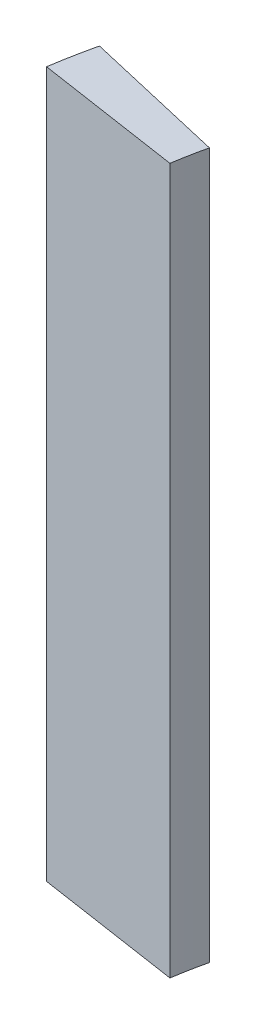
ISO-10303-21;
HEADER;
FILE_DESCRIPTION(('STEP AP214'),'2;1');
FILE_NAME('part.step','',(''),(''),'','','');
FILE_SCHEMA(('AUTOMOTIVE_DESIGN { 1 0 10303 214 1 1 1 1 }'));
ENDSEC;
DATA;
#1=APPLICATION_CONTEXT('core data for automotive mechanical design processes');
#2=APPLICATION_PROTOCOL_DEFINITION('international standard','automotive_design',2000,#1);
#3=PRODUCT_CONTEXT('',#1,'mechanical');
#4=PRODUCT('Part','Part','',(#3));
#5=PRODUCT_RELATED_PRODUCT_CATEGORY('part','',(#4));
#6=PRODUCT_DEFINITION_FORMATION('','',#4);
#7=PRODUCT_DEFINITION_CONTEXT('part definition',#1,'design');
#8=PRODUCT_DEFINITION('design','',#6,#7);
#9=PRODUCT_DEFINITION_SHAPE('','',#8);
#10=(LENGTH_UNIT() NAMED_UNIT(*) SI_UNIT(.MILLI.,.METRE.));
#11=(NAMED_UNIT(*) PLANE_ANGLE_UNIT() SI_UNIT($,.RADIAN.));
#12=(NAMED_UNIT(*) SI_UNIT($,.STERADIAN.) SOLID_ANGLE_UNIT());
#13=UNCERTAINTY_MEASURE_WITH_UNIT(LENGTH_MEASURE(1.E-05),#10,'distance_accuracy_value','');
#14=(GEOMETRIC_REPRESENTATION_CONTEXT(3) GLOBAL_UNCERTAINTY_ASSIGNED_CONTEXT((#13)) GLOBAL_UNIT_ASSIGNED_CONTEXT((#10,
#11,#12)) REPRESENTATION_CONTEXT('',''));
#15=CARTESIAN_POINT('',(0.,0.,0.));
#16=DIRECTION('',(0.,0.,1.));
#17=DIRECTION('',(1.,0.,0.));
#18=AXIS2_PLACEMENT_3D('',#15,#16,#17);
#19=CARTESIAN_POINT('',(33.9255423572014,48.,6.63702783067305));
#20=DIRECTION('',(0.,-1.,0.));
#21=DIRECTION('',(0.,0.,-1.));
#22=AXIS2_PLACEMENT_3D('',#19,#20,#21);
#23=CYLINDRICAL_SURFACE('',#22,29.522);
#24=CARTESIAN_POINT('',(33.9255423572014,0.,6.63702783067305));
#25=DIRECTION('',(0.,1.,0.));
#26=DIRECTION('',(0.,0.,1.));
#27=AXIS2_PLACEMENT_3D('',#24,#25,#26);
#28=CIRCLE('',#27,29.522);
#29=CARTESIAN_POINT('',(5.16699913950025,0.,-0.0334051384537461));
#30=VERTEX_POINT('',#29);
#31=CARTESIAN_POINT('',(4.73538549879826,0.,2.22304702171853));
#32=VERTEX_POINT('',#31);
#33=EDGE_CURVE('E98',#30,#32,#28,.T.);
#34=ORIENTED_EDGE('',*,*,#33,.F.);
#35=DIRECTION('',(0.,-1.,0.));
#36=VECTOR('',#35,1.);
#37=CARTESIAN_POINT('',(5.16699913950025,48.,-0.0334051384537461));
#38=LINE('',#37,#36);
#39=CARTESIAN_POINT('',(5.16699913950025,48.,-0.0334051384537461));
#40=VERTEX_POINT('',#39);
#41=EDGE_CURVE('E11',#40,#30,#38,.T.);
#42=ORIENTED_EDGE('',*,*,#41,.F.);
#43=CARTESIAN_POINT('',(33.9255423572014,48.,6.63702783067305));
#44=DIRECTION('',(0.,1.,0.));
#45=DIRECTION('',(0.,0.,1.));
#46=AXIS2_PLACEMENT_3D('',#43,#44,#45);
#47=CIRCLE('',#46,29.522);
#48=CARTESIAN_POINT('',(4.73538549879826,48.,2.22304702171853));
#49=VERTEX_POINT('',#48);
#50=EDGE_CURVE('E86',#40,#49,#47,.T.);
#51=ORIENTED_EDGE('',*,*,#50,.T.);
#52=DIRECTION('',(0.,-1.,0.));
#53=VECTOR('',#52,1.);
#54=CARTESIAN_POINT('',(4.73538549879826,48.,2.22304702171853));
#55=LINE('',#54,#53);
#56=EDGE_CURVE('E75',#49,#32,#55,.T.);
#57=ORIENTED_EDGE('',*,*,#56,.T.);
#58=EDGE_LOOP('',(#34,#42,#51,#57));
#59=FACE_BOUND('',#58,.T.);
#60=ADVANCED_FACE('F36',(#59),#23,.F.);
#61=CARTESIAN_POINT('',(-8.18071080784864,48.,-3.12939626769461));
#62=DIRECTION('',(-0.225950734549692,0.,0.974138730138811));
#63=DIRECTION('',(0.974138730138811,0.,0.225950734549692));
#64=AXIS2_PLACEMENT_3D('',#61,#62,#63);
#65=PLANE('',#64);
#66=DIRECTION('',(-0.974138730138811,0.,-0.225950734549692));
#67=VECTOR('',#66,1.);
#68=CARTESIAN_POINT('',(-8.18071080784864,0.,-3.12939626769461));
#69=LINE('',#68,#67);
#70=CARTESIAN_POINT('',(-4.57438816191935,0.,-2.29291248395797));
#71=VERTEX_POINT('',#70);
#72=EDGE_CURVE('E91',#30,#71,#69,.T.);
#73=ORIENTED_EDGE('',*,*,#72,.T.);
#74=DIRECTION('',(0.,-1.,0.));
#75=VECTOR('',#74,1.);
#76=CARTESIAN_POINT('',(-4.57438816191935,48.,-2.29291248395797));
#77=LINE('',#76,#75);
#78=CARTESIAN_POINT('',(-4.57438816191935,48.,-2.29291248395797));
#79=VERTEX_POINT('',#78);
#80=EDGE_CURVE('E44',#79,#71,#77,.T.);
#81=ORIENTED_EDGE('',*,*,#80,.F.);
#82=DIRECTION('',(-0.974138730138811,0.,-0.225950734549692));
#83=VECTOR('',#82,1.);
#84=CARTESIAN_POINT('',(-8.18071080784864,48.,-3.12939626769461));
#85=LINE('',#84,#83);
#86=EDGE_CURVE('E81',#40,#79,#85,.T.);
#87=ORIENTED_EDGE('',*,*,#86,.F.);
#88=ORIENTED_EDGE('',*,*,#41,.T.);
#89=EDGE_LOOP('',(#73,#81,#87,#88));
#90=FACE_BOUND('',#89,.T.);
#91=ADVANCED_FACE('F89',(#90),#65,.F.);
#92=CARTESIAN_POINT('',(33.9255423572014,48.,6.63702783067305));
#93=DIRECTION('',(0.,-1.,0.));
#94=DIRECTION('',(0.,0.,-1.));
#95=AXIS2_PLACEMENT_3D('',#92,#93,#94);
#96=CYLINDRICAL_SURFACE('',#95,39.522);
#97=CARTESIAN_POINT('',(33.9255423572014,0.,6.63702783067305));
#98=DIRECTION('',(0.,1.,0.));
#99=DIRECTION('',(0.,0.,1.));
#100=AXIS2_PLACEMENT_3D('',#97,#98,#99);
#101=CIRCLE('',#100,39.522);
#102=CARTESIAN_POINT('',(-5.15237907214999,0.,0.729021334278678));
#103=VERTEX_POINT('',#102);
#104=EDGE_CURVE('E68',#71,#103,#101,.T.);
#105=ORIENTED_EDGE('',*,*,#104,.T.);
#106=DIRECTION('',(0.,-1.,0.));
#107=VECTOR('',#106,1.);
#108=CARTESIAN_POINT('',(-5.15237907214999,48.,0.729021334278678));
#109=LINE('',#108,#107);
#110=CARTESIAN_POINT('',(-5.15237907214999,48.,0.729021334278678));
#111=VERTEX_POINT('',#110);
#112=EDGE_CURVE('E92',#111,#103,#109,.T.);
#113=ORIENTED_EDGE('',*,*,#112,.F.);
#114=CARTESIAN_POINT('',(33.9255423572014,48.,6.63702783067305));
#115=DIRECTION('',(0.,1.,0.));
#116=DIRECTION('',(0.,0.,1.));
#117=AXIS2_PLACEMENT_3D('',#114,#115,#116);
#118=CIRCLE('',#117,39.522);
#119=EDGE_CURVE('E85',#79,#111,#118,.T.);
#120=ORIENTED_EDGE('',*,*,#119,.F.);
#121=ORIENTED_EDGE('',*,*,#80,.T.);
#122=EDGE_LOOP('',(#105,#113,#120,#121));
#123=FACE_BOUND('',#122,.T.);
#124=ADVANCED_FACE('F93',(#123),#96,.T.);
#125=CARTESIAN_POINT('',(-8.92744728497368,48.,0.158614460072997));
#126=DIRECTION('',(0.149402568022947,0.,-0.988776452322844));
#127=DIRECTION('',(-0.988776452322844,0.,-0.149402568022947));
#128=AXIS2_PLACEMENT_3D('',#125,#126,#127);
#129=PLANE('',#128);
#130=DIRECTION('',(0.988776452322844,0.,0.149402568022947));
#131=VECTOR('',#130,1.);
#132=CARTESIAN_POINT('',(-8.92744728497368,0.,0.158614460072997));
#133=LINE('',#132,#131);
#134=EDGE_CURVE('E103',#103,#32,#133,.T.);
#135=ORIENTED_EDGE('',*,*,#134,.T.);
#136=ORIENTED_EDGE('',*,*,#56,.F.);
#137=DIRECTION('',(0.988776452322844,0.,0.149402568022947));
#138=VECTOR('',#137,1.);
#139=CARTESIAN_POINT('',(-8.92744728497368,48.,0.158614460072997));
#140=LINE('',#139,#138);
#141=EDGE_CURVE('E52',#111,#49,#140,.T.);
#142=ORIENTED_EDGE('',*,*,#141,.F.);
#143=ORIENTED_EDGE('',*,*,#112,.T.);
#144=EDGE_LOOP('',(#135,#136,#142,#143));
#145=FACE_BOUND('',#144,.T.);
#146=ADVANCED_FACE('F108',(#145),#129,.F.);
#147=CARTESIAN_POINT('',(-8.89770427185869,48.,-0.0382308243046787));
#148=DIRECTION('',(0.,1.,0.));
#149=DIRECTION('',(0.,0.,1.));
#150=AXIS2_PLACEMENT_3D('',#147,#148,#149);
#151=PLANE('',#150);
#152=ORIENTED_EDGE('',*,*,#50,.F.);
#153=ORIENTED_EDGE('',*,*,#86,.T.);
#154=ORIENTED_EDGE('',*,*,#119,.T.);
#155=ORIENTED_EDGE('',*,*,#141,.T.);
#156=EDGE_LOOP('',(#152,#153,#154,#155));
#157=FACE_BOUND('',#156,.T.);
#158=ADVANCED_FACE('F83',(#157),#151,.T.);
#159=CARTESIAN_POINT('',(-8.89770427185869,0.,-0.0382308243046787));
#160=DIRECTION('',(0.,1.,0.));
#161=DIRECTION('',(0.,0.,1.));
#162=AXIS2_PLACEMENT_3D('',#159,#160,#161);
#163=PLANE('',#162);
#164=ORIENTED_EDGE('',*,*,#33,.T.);
#165=ORIENTED_EDGE('',*,*,#134,.F.);
#166=ORIENTED_EDGE('',*,*,#104,.F.);
#167=ORIENTED_EDGE('',*,*,#72,.F.);
#168=EDGE_LOOP('',(#164,#165,#166,#167));
#169=FACE_BOUND('',#168,.T.);
#170=ADVANCED_FACE('F110',(#169),#163,.F.);
#171=CLOSED_SHELL('',(#60,#91,#124,#146,#158,#170));
#172=MANIFOLD_SOLID_BREP('B2',#171);
#173=ADVANCED_BREP_SHAPE_REPRESENTATION('',(#18,#172),#14);
#174=SHAPE_DEFINITION_REPRESENTATION(#9,#173);
ENDSEC;
END-ISO-10303-21;
